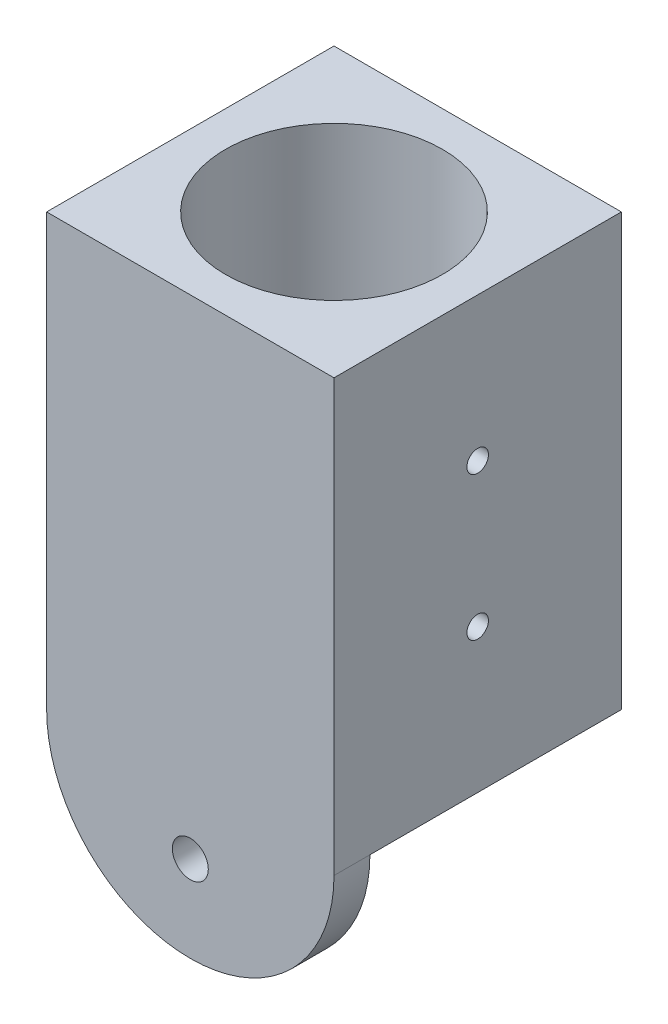
ISO-10303-21;
HEADER;
FILE_DESCRIPTION(('STEP AP214'),'2;1');
FILE_NAME('part.step','',(''),(''),'','','');
FILE_SCHEMA(('AUTOMOTIVE_DESIGN { 1 0 10303 214 1 1 1 1 }'));
ENDSEC;
DATA;
#1=APPLICATION_CONTEXT('core data for automotive mechanical design processes');
#2=APPLICATION_PROTOCOL_DEFINITION('international standard','automotive_design',2000,#1);
#3=PRODUCT_CONTEXT('',#1,'mechanical');
#4=PRODUCT('Part','Part','',(#3));
#5=PRODUCT_RELATED_PRODUCT_CATEGORY('part','',(#4));
#6=PRODUCT_DEFINITION_FORMATION('','',#4);
#7=PRODUCT_DEFINITION_CONTEXT('part definition',#1,'design');
#8=PRODUCT_DEFINITION('design','',#6,#7);
#9=PRODUCT_DEFINITION_SHAPE('','',#8);
#10=(LENGTH_UNIT() NAMED_UNIT(*) SI_UNIT(.MILLI.,.METRE.));
#11=(NAMED_UNIT(*) PLANE_ANGLE_UNIT() SI_UNIT($,.RADIAN.));
#12=(NAMED_UNIT(*) SI_UNIT($,.STERADIAN.) SOLID_ANGLE_UNIT());
#13=UNCERTAINTY_MEASURE_WITH_UNIT(LENGTH_MEASURE(1.E-05),#10,'distance_accuracy_value','');
#14=(GEOMETRIC_REPRESENTATION_CONTEXT(3) GLOBAL_UNCERTAINTY_ASSIGNED_CONTEXT((#13)) GLOBAL_UNIT_ASSIGNED_CONTEXT((#10,
#11,#12)) REPRESENTATION_CONTEXT('',''));
#15=CARTESIAN_POINT('',(0.,0.,0.));
#16=DIRECTION('',(0.,0.,1.));
#17=DIRECTION('',(1.,0.,0.));
#18=AXIS2_PLACEMENT_3D('',#15,#16,#17);
#19=CARTESIAN_POINT('',(0.,0.,0.));
#20=DIRECTION('',(0.,1.,0.));
#21=DIRECTION('',(0.,0.,1.));
#22=AXIS2_PLACEMENT_3D('',#19,#20,#21);
#23=PLANE('',#22);
#24=DIRECTION('',(-1.,0.,0.));
#25=VECTOR('',#24,1.);
#26=CARTESIAN_POINT('',(-20.,0.,15.));
#27=LINE('',#26,#25);
#28=CARTESIAN_POINT('',(20.,0.,15.));
#29=VERTEX_POINT('',#28);
#30=CARTESIAN_POINT('',(-20.,0.,15.));
#31=VERTEX_POINT('',#30);
#32=EDGE_CURVE('E108',#29,#31,#27,.T.);
#33=ORIENTED_EDGE('',*,*,#32,.T.);
#34=DIRECTION('',(0.,0.,1.));
#35=VECTOR('',#34,1.);
#36=CARTESIAN_POINT('',(-20.,0.,-20.));
#37=LINE('',#36,#35);
#38=CARTESIAN_POINT('',(-20.,0.,-20.));
#39=VERTEX_POINT('',#38);
#40=EDGE_CURVE('E123',#39,#31,#37,.T.);
#41=ORIENTED_EDGE('',*,*,#40,.F.);
#42=DIRECTION('',(-1.,0.,0.));
#43=VECTOR('',#42,1.);
#44=CARTESIAN_POINT('',(-20.,0.,-20.));
#45=LINE('',#44,#43);
#46=CARTESIAN_POINT('',(20.,0.,-20.));
#47=VERTEX_POINT('',#46);
#48=EDGE_CURVE('E76',#47,#39,#45,.T.);
#49=ORIENTED_EDGE('',*,*,#48,.F.);
#50=DIRECTION('',(0.,0.,-1.));
#51=VECTOR('',#50,1.);
#52=CARTESIAN_POINT('',(20.,0.,-20.));
#53=LINE('',#52,#51);
#54=EDGE_CURVE('E116',#29,#47,#53,.T.);
#55=ORIENTED_EDGE('',*,*,#54,.F.);
#56=EDGE_LOOP('',(#33,#41,#49,#55));
#57=FACE_BOUND('',#56,.T.);
#58=ADVANCED_FACE('F38',(#57),#23,.F.);
#59=CARTESIAN_POINT('',(20.,60.,-20.));
#60=DIRECTION('',(-1.,0.,0.));
#61=DIRECTION('',(0.,0.,1.));
#62=AXIS2_PLACEMENT_3D('',#59,#60,#61);
#63=PLANE('',#62);
#64=CARTESIAN_POINT('',(20.,40.,0.));
#65=DIRECTION('',(1.,0.,0.));
#66=DIRECTION('',(0.,0.,-1.));
#67=AXIS2_PLACEMENT_3D('',#64,#65,#66);
#68=CIRCLE('',#67,1.5);
#69=CARTESIAN_POINT('',(20.,40.,-1.5));
#70=VERTEX_POINT('',#69);
#71=EDGE_CURVE('E250',#70,#70,#68,.T.);
#72=ORIENTED_EDGE('',*,*,#71,.F.);
#73=EDGE_LOOP('',(#72));
#74=FACE_BOUND('',#73,.T.);
#75=CARTESIAN_POINT('',(20.,20.,0.));
#76=DIRECTION('',(1.,0.,0.));
#77=DIRECTION('',(0.,0.,-1.));
#78=AXIS2_PLACEMENT_3D('',#75,#76,#77);
#79=CIRCLE('',#78,1.5);
#80=CARTESIAN_POINT('',(20.,20.,-1.5));
#81=VERTEX_POINT('',#80);
#82=EDGE_CURVE('E243',#81,#81,#79,.T.);
#83=ORIENTED_EDGE('',*,*,#82,.F.);
#84=EDGE_LOOP('',(#83));
#85=FACE_BOUND('',#84,.T.);
#86=CARTESIAN_POINT('',(20.,0.,20.));
#87=VERTEX_POINT('',#86);
#88=EDGE_CURVE('E102',#87,#29,#53,.T.);
#89=ORIENTED_EDGE('',*,*,#88,.T.);
#90=ORIENTED_EDGE('',*,*,#54,.T.);
#91=DIRECTION('',(0.,-1.,0.));
#92=VECTOR('',#91,1.);
#93=CARTESIAN_POINT('',(20.,60.,-20.));
#94=LINE('',#93,#92);
#95=CARTESIAN_POINT('',(20.,60.,-20.));
#96=VERTEX_POINT('',#95);
#97=EDGE_CURVE('E11',#96,#47,#94,.T.);
#98=ORIENTED_EDGE('',*,*,#97,.F.);
#99=DIRECTION('',(0.,0.,-1.));
#100=VECTOR('',#99,1.);
#101=CARTESIAN_POINT('',(20.,60.,-20.));
#102=LINE('',#101,#100);
#103=CARTESIAN_POINT('',(20.,60.,20.));
#104=VERTEX_POINT('',#103);
#105=EDGE_CURVE('E129',#104,#96,#102,.T.);
#106=ORIENTED_EDGE('',*,*,#105,.F.);
#107=DIRECTION('',(0.,-1.,0.));
#108=VECTOR('',#107,1.);
#109=CARTESIAN_POINT('',(20.,60.,20.));
#110=LINE('',#109,#108);
#111=EDGE_CURVE('E122',#104,#87,#110,.T.);
#112=ORIENTED_EDGE('',*,*,#111,.T.);
#113=EDGE_LOOP('',(#89,#90,#98,#106,#112));
#114=FACE_BOUND('',#113,.T.);
#115=ADVANCED_FACE('F40',(#74,#85,#114),#63,.F.);
#116=CARTESIAN_POINT('',(-20.,60.,-20.));
#117=DIRECTION('',(0.,0.,1.));
#118=DIRECTION('',(1.,0.,0.));
#119=AXIS2_PLACEMENT_3D('',#116,#117,#118);
#120=PLANE('',#119);
#121=ORIENTED_EDGE('',*,*,#48,.T.);
#122=DIRECTION('',(0.,-1.,0.));
#123=VECTOR('',#122,1.);
#124=CARTESIAN_POINT('',(-20.,60.,-20.));
#125=LINE('',#124,#123);
#126=CARTESIAN_POINT('',(-20.,60.,-20.));
#127=VERTEX_POINT('',#126);
#128=EDGE_CURVE('E53',#127,#39,#125,.T.);
#129=ORIENTED_EDGE('',*,*,#128,.F.);
#130=DIRECTION('',(-1.,0.,0.));
#131=VECTOR('',#130,1.);
#132=CARTESIAN_POINT('',(-20.,60.,-20.));
#133=LINE('',#132,#131);
#134=EDGE_CURVE('E88',#96,#127,#133,.T.);
#135=ORIENTED_EDGE('',*,*,#134,.F.);
#136=ORIENTED_EDGE('',*,*,#97,.T.);
#137=EDGE_LOOP('',(#121,#129,#135,#136));
#138=FACE_BOUND('',#137,.T.);
#139=ADVANCED_FACE('F182',(#138),#120,.F.);
#140=CARTESIAN_POINT('',(-20.,60.,-20.));
#141=DIRECTION('',(1.,0.,0.));
#142=DIRECTION('',(0.,0.,-1.));
#143=AXIS2_PLACEMENT_3D('',#140,#141,#142);
#144=PLANE('',#143);
#145=CARTESIAN_POINT('',(-20.,40.,0.));
#146=DIRECTION('',(1.,0.,0.));
#147=DIRECTION('',(0.,0.,-1.));
#148=AXIS2_PLACEMENT_3D('',#145,#146,#147);
#149=CIRCLE('',#148,1.5);
#150=CARTESIAN_POINT('',(-20.,40.,-1.5));
#151=VERTEX_POINT('',#150);
#152=EDGE_CURVE('E240',#151,#151,#149,.T.);
#153=ORIENTED_EDGE('',*,*,#152,.T.);
#154=EDGE_LOOP('',(#153));
#155=FACE_BOUND('',#154,.T.);
#156=CARTESIAN_POINT('',(-20.,20.,0.));
#157=DIRECTION('',(1.,0.,0.));
#158=DIRECTION('',(0.,0.,-1.));
#159=AXIS2_PLACEMENT_3D('',#156,#157,#158);
#160=CIRCLE('',#159,1.5);
#161=CARTESIAN_POINT('',(-20.,20.,-1.5));
#162=VERTEX_POINT('',#161);
#163=EDGE_CURVE('E142',#162,#162,#160,.T.);
#164=ORIENTED_EDGE('',*,*,#163,.T.);
#165=EDGE_LOOP('',(#164));
#166=FACE_BOUND('',#165,.T.);
#167=ORIENTED_EDGE('',*,*,#40,.T.);
#168=DIRECTION('',(0.,0.,1.));
#169=VECTOR('',#168,1.);
#170=CARTESIAN_POINT('',(-20.,0.,15.));
#171=LINE('',#170,#169);
#172=CARTESIAN_POINT('',(-20.,0.,20.));
#173=VERTEX_POINT('',#172);
#174=EDGE_CURVE('E105',#31,#173,#171,.T.);
#175=ORIENTED_EDGE('',*,*,#174,.T.);
#176=DIRECTION('',(0.,-1.,0.));
#177=VECTOR('',#176,1.);
#178=CARTESIAN_POINT('',(-20.,60.,20.));
#179=LINE('',#178,#177);
#180=CARTESIAN_POINT('',(-20.,60.,20.));
#181=VERTEX_POINT('',#180);
#182=EDGE_CURVE('E131',#181,#173,#179,.T.);
#183=ORIENTED_EDGE('',*,*,#182,.F.);
#184=DIRECTION('',(0.,0.,1.));
#185=VECTOR('',#184,1.);
#186=CARTESIAN_POINT('',(-20.,60.,-20.));
#187=LINE('',#186,#185);
#188=EDGE_CURVE('E273',#127,#181,#187,.T.);
#189=ORIENTED_EDGE('',*,*,#188,.F.);
#190=ORIENTED_EDGE('',*,*,#128,.T.);
#191=EDGE_LOOP('',(#167,#175,#183,#189,#190));
#192=FACE_BOUND('',#191,.T.);
#193=ADVANCED_FACE('F188',(#155,#166,#192),#144,.F.);
#194=CARTESIAN_POINT('',(-20.,60.,20.));
#195=DIRECTION('',(0.,0.,-1.));
#196=DIRECTION('',(-1.,0.,0.));
#197=AXIS2_PLACEMENT_3D('',#194,#195,#196);
#198=PLANE('',#197);
#199=ORIENTED_EDGE('',*,*,#182,.T.);
#200=CARTESIAN_POINT('',(0.,0.,20.));
#201=DIRECTION('',(0.,0.,1.));
#202=DIRECTION('',(1.,0.,0.));
#203=AXIS2_PLACEMENT_3D('',#200,#201,#202);
#204=CIRCLE('',#203,20.);
#205=EDGE_CURVE('E83',#173,#87,#204,.T.);
#206=ORIENTED_EDGE('',*,*,#205,.T.);
#207=ORIENTED_EDGE('',*,*,#111,.F.);
#208=DIRECTION('',(1.,0.,0.));
#209=VECTOR('',#208,1.);
#210=CARTESIAN_POINT('',(-20.,60.,20.));
#211=LINE('',#210,#209);
#212=EDGE_CURVE('E62',#181,#104,#211,.T.);
#213=ORIENTED_EDGE('',*,*,#212,.F.);
#214=EDGE_LOOP('',(#199,#206,#207,#213));
#215=FACE_BOUND('',#214,.T.);
#216=CARTESIAN_POINT('',(0.,-8.,20.));
#217=DIRECTION('',(0.,0.,1.));
#218=DIRECTION('',(1.,0.,0.));
#219=AXIS2_PLACEMENT_3D('',#216,#217,#218);
#220=CIRCLE('',#219,2.5);
#221=CARTESIAN_POINT('',(2.5,-8.,20.));
#222=VERTEX_POINT('',#221);
#223=EDGE_CURVE('E263',#222,#222,#220,.T.);
#224=ORIENTED_EDGE('',*,*,#223,.F.);
#225=EDGE_LOOP('',(#224));
#226=FACE_BOUND('',#225,.T.);
#227=ADVANCED_FACE('F185',(#215,#226),#198,.F.);
#228=CARTESIAN_POINT('',(0.,60.,0.));
#229=DIRECTION('',(0.,1.,0.));
#230=DIRECTION('',(0.,0.,1.));
#231=AXIS2_PLACEMENT_3D('',#228,#229,#230);
#232=PLANE('',#231);
#233=CARTESIAN_POINT('',(0.,60.,0.));
#234=DIRECTION('',(0.,1.,0.));
#235=DIRECTION('',(0.,0.,1.));
#236=AXIS2_PLACEMENT_3D('',#233,#234,#235);
#237=CIRCLE('',#236,15.1);
#238=CARTESIAN_POINT('',(0.,60.,15.1));
#239=VERTEX_POINT('',#238);
#240=EDGE_CURVE('E268',#239,#239,#237,.T.);
#241=ORIENTED_EDGE('',*,*,#240,.F.);
#242=EDGE_LOOP('',(#241));
#243=FACE_BOUND('',#242,.T.);
#244=ORIENTED_EDGE('',*,*,#105,.T.);
#245=ORIENTED_EDGE('',*,*,#134,.T.);
#246=ORIENTED_EDGE('',*,*,#188,.T.);
#247=ORIENTED_EDGE('',*,*,#212,.T.);
#248=EDGE_LOOP('',(#244,#245,#246,#247));
#249=FACE_BOUND('',#248,.T.);
#250=ADVANCED_FACE('F174',(#243,#249),#232,.T.);
#251=CARTESIAN_POINT('',(0.,9.99999999999999,0.));
#252=DIRECTION('',(0.,1.,0.));
#253=DIRECTION('',(0.,0.,1.));
#254=AXIS2_PLACEMENT_3D('',#251,#252,#253);
#255=CYLINDRICAL_SURFACE('',#254,15.1);
#256=CARTESIAN_POINT('',(-15.0253119767944,40.,-1.5));
#257=CARTESIAN_POINT('',(-15.025312956074,39.9159676620919,-1.49999635854613));
#258=CARTESIAN_POINT('',(-15.0260245276725,39.8318796909114,-1.49291478510042));
#259=CARTESIAN_POINT('',(-15.028793551497,39.6660349131521,-1.46477185820528));
#260=CARTESIAN_POINT('',(-15.03085248871,39.5842807826705,-1.44369507968879));
#261=CARTESIAN_POINT('',(-15.0360807748948,39.4255293978987,-1.38818135253405));
#262=CARTESIAN_POINT('',(-15.0392494524589,39.3485293004147,-1.35375248074173));
#263=CARTESIAN_POINT('',(-15.0463393621317,39.201417488061,-1.27252733745513));
#264=CARTESIAN_POINT('',(-15.05026044424,39.1313044043924,-1.22573353035035));
#265=CARTESIAN_POINT('',(-15.0584291270942,38.9996884271419,-1.12092628167147));
#266=CARTESIAN_POINT('',(-15.0626777301768,38.9382137328839,-1.06287750232365));
#267=CARTESIAN_POINT('',(-15.0710136412484,38.8258623723675,-0.937283575420634));
#268=CARTESIAN_POINT('',(-15.0751009418651,38.7749861900552,-0.869737994461096));
#269=CARTESIAN_POINT('',(-15.0826635983521,38.6851787557144,-0.72689531541232));
#270=CARTESIAN_POINT('',(-15.0861376707466,38.6462724329321,-0.651582470180894));
#271=CARTESIAN_POINT('',(-15.0920715347339,38.5816686124249,-0.495452469131725));
#272=CARTESIAN_POINT('',(-15.0945313507482,38.5559707966588,-0.414635445899537));
#273=CARTESIAN_POINT('',(-15.0981525138302,38.5185960854439,-0.250075883600476));
#274=CARTESIAN_POINT('',(-15.0993181456551,38.5068729134921,-0.166343950618246));
#275=CARTESIAN_POINT('',(-15.100234174601,38.4976370858915,0.00190655759439232));
#276=CARTESIAN_POINT('',(-15.0999846079687,38.5001240662856,0.0864251126221106));
#277=CARTESIAN_POINT('',(-15.0981018679929,38.5192003682383,0.253535560434282));
#278=CARTESIAN_POINT('',(-15.0964735769364,38.5357399280402,0.336133196401713));
#279=CARTESIAN_POINT('',(-15.0920219994832,38.5823743756564,0.497374352123942));
#280=CARTESIAN_POINT('',(-15.0891986977396,38.612469437557,0.576017821082989));
#281=CARTESIAN_POINT('',(-15.0826661343107,38.685415201237,0.727275160741129));
#282=CARTESIAN_POINT('',(-15.0789553445811,38.7282879348315,0.799878337650498));
#283=CARTESIAN_POINT('',(-15.0710642123586,38.8255560438999,0.936877465459625));
#284=CARTESIAN_POINT('',(-15.0668838562791,38.879951752825,1.00127317876582));
#285=CARTESIAN_POINT('',(-15.0585014337633,38.9990016032106,1.12032085957513));
#286=CARTESIAN_POINT('',(-15.054299351531,39.0636990304483,1.17492954862421));
#287=CARTESIAN_POINT('',(-15.0463651004589,39.201365684078,1.27251801061355));
#288=CARTESIAN_POINT('',(-15.0426329322861,39.2743349222103,1.31549776704826));
#289=CARTESIAN_POINT('',(-15.0360607178808,39.426507005085,1.38860805601259));
#290=CARTESIAN_POINT('',(-15.0332208560381,39.505711134007,1.41873593323833));
#291=CARTESIAN_POINT('',(-15.0287585753405,39.6680883326636,1.46525308871646));
#292=CARTESIAN_POINT('',(-15.0271361198954,39.7512612830321,1.48164277988374));
#293=CARTESIAN_POINT('',(-15.0252986591232,39.9188352636901,1.50016268663854));
#294=CARTESIAN_POINT('',(-15.0250776785925,40.0032295405848,1.50235344042828));
#295=CARTESIAN_POINT('',(-15.0260524182927,40.1711840102969,1.49257225368717));
#296=CARTESIAN_POINT('',(-15.0272481196383,40.2547442142182,1.48060050195128));
#297=CARTESIAN_POINT('',(-15.0309160596127,40.4184822238691,1.44288477969783));
#298=CARTESIAN_POINT('',(-15.0333856461404,40.4986666838853,1.41716941799686));
#299=CARTESIAN_POINT('',(-15.0393209391003,40.6535838762131,1.35272564260952));
#300=CARTESIAN_POINT('',(-15.0427866680578,40.7283164851969,1.31399693465547));
#301=CARTESIAN_POINT('',(-15.0503382064572,40.8704845722181,1.2244741127262));
#302=CARTESIAN_POINT('',(-15.0544260614167,40.9378946728515,1.17363987299589));
#303=CARTESIAN_POINT('',(-15.0627545443571,41.0632469104025,1.06140651663175));
#304=CARTESIAN_POINT('',(-15.0669951760684,41.1211888159303,1.00000714187558));
#305=CARTESIAN_POINT('',(-15.0751694218504,41.2261685790411,0.868123835144984));
#306=CARTESIAN_POINT('',(-15.0791018911967,41.2731669510903,0.797608391658785));
#307=CARTESIAN_POINT('',(-15.0862000664518,41.3546538558809,0.649650329668303));
#308=CARTESIAN_POINT('',(-15.0893657827459,41.389142558064,0.572207805008102));
#309=CARTESIAN_POINT('',(-15.0945685839412,41.4445641728181,0.412731881610149));
#310=CARTESIAN_POINT('',(-15.0966076555916,41.4655209589395,0.330706846940061));
#311=CARTESIAN_POINT('',(-15.099335565752,41.4933617737986,0.164281005364229));
#312=CARTESIAN_POINT('',(-15.1000244416734,41.5002461924544,0.0798802643504142));
#313=CARTESIAN_POINT('',(-15.0999743264919,41.4997414076765,-0.0885132586038638));
#314=CARTESIAN_POINT('',(-15.0992414683536,41.4924135122405,-0.172506232884098));
#315=CARTESIAN_POINT('',(-15.096442335095,41.4638206390987,-0.338061727779914));
#316=CARTESIAN_POINT('',(-15.0943760588904,41.4425556500599,-0.419624246419132));
#317=CARTESIAN_POINT('',(-15.0891416171645,41.3867091488097,-0.578003288244201));
#318=CARTESIAN_POINT('',(-15.0859735976019,41.3521294004693,-0.654820438508598));
#319=CARTESIAN_POINT('',(-15.078888864656,41.2706415319087,-0.801569837575121));
#320=CARTESIAN_POINT('',(-15.0749721559724,41.2237334890742,-0.871502129590262));
#321=CARTESIAN_POINT('',(-15.0668086636542,41.1186906745015,-1.00281085394436));
#322=CARTESIAN_POINT('',(-15.0625605816352,41.0605102643219,-1.06415069694839));
#323=CARTESIAN_POINT('',(-15.0542241088092,40.9346639349868,-1.17622425255196));
#324=CARTESIAN_POINT('',(-15.050135756584,40.8669957419999,-1.22695541540431));
#325=CARTESIAN_POINT('',(-15.042570630608,40.7239089433625,-1.31647186691678));
#326=CARTESIAN_POINT('',(-15.0390954200226,40.6484712829841,-1.35522680653066));
#327=CARTESIAN_POINT('',(-15.0331686996374,40.4921729527212,-1.41946790711139));
#328=CARTESIAN_POINT('',(-15.0307160348248,40.4113185218565,-1.444969046934));
#329=CARTESIAN_POINT('',(-15.0277311589647,40.2750045514355,-1.47561362318629));
#330=CARTESIAN_POINT('',(-15.0268282506956,40.2204167180033,-1.48474603116336));
#331=CARTESIAN_POINT('',(-15.0256183386627,40.1105606166398,-1.49694040505908));
#332=CARTESIAN_POINT('',(-15.0253113324391,40.0552923515182,-1.50000239603648));
#333=CARTESIAN_POINT('',(-15.0253119767944,40.,-1.5));
#334=B_SPLINE_CURVE_WITH_KNOTS('',3,(#256,#257,#258,#259,#260,#261,#262,#263,#264,#265,#266,
#267,#268,#269,#270,#271,#272,#273,#274,#275,#276,#277,#278,#279,#280,#281,#282,#283,#284,#285,
#286,#287,#288,#289,#290,#291,#292,#293,#294,#295,#296,#297,#298,#299,#300,#301,#302,#303,#304,
#305,#306,#307,#308,#309,#310,#311,#312,#313,#314,#315,#316,#317,#318,#319,#320,#321,#322,#323,
#324,#325,#326,#327,#328,#329,#330,#331,#332,#333),.UNSPECIFIED.,.T.,.F.,(4,2,2,2,2,2,2,2,2,2,2,
2,2,2,2,2,2,2,2,2,2,2,2,2,2,2,2,2,2,2,2,2,2,2,2,2,2,2,4),(0.,0.251895097196481,0.50406828696038,
0.75608917138904,1.00805986471088,1.26083488254587,1.51362143998953,1.76693095868192,
2.02023437776912,2.27269664114699,2.52515243837155,2.77671796950038,3.02828673144791,
3.28029179364622,3.53230414935096,3.7854047994611,4.03850580880849,4.29165908560718,
4.54480475335873,4.79687040216313,5.04893269081457,5.30047231646477,5.552017630503,
5.80440863162634,6.05680579992193,6.31010000309801,6.56339077531053,6.81623345189484,
7.06906912260185,7.32081655553196,7.57256419316889,7.82427849203737,8.07599121091297,
8.32874517901135,8.58155982571251,8.83500997565597,9.08817306120622,9.25391794111063,
9.41966213681694),.UNSPECIFIED.);
#335=CARTESIAN_POINT('',(-15.0253119767944,40.,-1.5));
#336=VERTEX_POINT('',#335);
#337=EDGE_CURVE('E42',#336,#336,#334,.T.);
#338=ORIENTED_EDGE('',*,*,#337,.T.);
#339=EDGE_LOOP('',(#338));
#340=FACE_BOUND('',#339,.T.);
#341=CARTESIAN_POINT('',(15.0253119767944,40.,-1.5));
#342=CARTESIAN_POINT('',(15.025312956074,40.0840323379081,-1.49999635854613));
#343=CARTESIAN_POINT('',(15.0260245276725,40.1681203090886,-1.49291478510043));
#344=CARTESIAN_POINT('',(15.028793551497,40.3339650868479,-1.46477185820529));
#345=CARTESIAN_POINT('',(15.03085248871,40.4157192173295,-1.44369507968879));
#346=CARTESIAN_POINT('',(15.0360807748948,40.5744706021013,-1.38818135253405));
#347=CARTESIAN_POINT('',(15.0392494524589,40.6514706995853,-1.35375248074173));
#348=CARTESIAN_POINT('',(15.0463393621317,40.798582511939,-1.27252733745513));
#349=CARTESIAN_POINT('',(15.05026044424,40.8686955956076,-1.22573353035035));
#350=CARTESIAN_POINT('',(15.0584291270942,41.0003115728581,-1.12092628167147));
#351=CARTESIAN_POINT('',(15.0626777301768,41.0617862671161,-1.06287750232365));
#352=CARTESIAN_POINT('',(15.0710136412484,41.1741376276325,-0.937283575420637));
#353=CARTESIAN_POINT('',(15.0751009418651,41.2250138099448,-0.869737994461099));
#354=CARTESIAN_POINT('',(15.0826635983521,41.3148212442856,-0.726895315412323));
#355=CARTESIAN_POINT('',(15.0861376707466,41.3537275670679,-0.651582470180896));
#356=CARTESIAN_POINT('',(15.0920715347339,41.4183313875751,-0.495452469131727));
#357=CARTESIAN_POINT('',(15.0945313507482,41.4440292033412,-0.41463544589954));
#358=CARTESIAN_POINT('',(15.0981525138302,41.4814039145561,-0.250075883600479));
#359=CARTESIAN_POINT('',(15.0993181456551,41.4931270865079,-0.166343950618248));
#360=CARTESIAN_POINT('',(15.100234174601,41.5023629141085,0.00190655759438969));
#361=CARTESIAN_POINT('',(15.0999846079687,41.4998759337144,0.086425112622108));
#362=CARTESIAN_POINT('',(15.0981018679929,41.4807996317617,0.253535560434279));
#363=CARTESIAN_POINT('',(15.0964735769364,41.4642600719598,0.33613319640171));
#364=CARTESIAN_POINT('',(15.0920219994832,41.4176256243436,0.497374352123939));
#365=CARTESIAN_POINT('',(15.0891986977396,41.387530562443,0.576017821082986));
#366=CARTESIAN_POINT('',(15.0826661343107,41.314584798763,0.727275160741126));
#367=CARTESIAN_POINT('',(15.0789553445811,41.2717120651685,0.799878337650496));
#368=CARTESIAN_POINT('',(15.0710642123586,41.1744439561001,0.936877465459623));
#369=CARTESIAN_POINT('',(15.0668838562791,41.120048247175,1.00127317876582));
#370=CARTESIAN_POINT('',(15.0585014337633,41.0009983967895,1.12032085957512));
#371=CARTESIAN_POINT('',(15.054299351531,40.9363009695517,1.1749295486242));
#372=CARTESIAN_POINT('',(15.0463651004589,40.798634315922,1.27251801061355));
#373=CARTESIAN_POINT('',(15.0426329322861,40.7256650777897,1.31549776704826));
#374=CARTESIAN_POINT('',(15.0360607178808,40.573492994915,1.38860805601259));
#375=CARTESIAN_POINT('',(15.0332208560381,40.494288865993,1.41873593323833));
#376=CARTESIAN_POINT('',(15.0287585753405,40.3319116673364,1.46525308871646));
#377=CARTESIAN_POINT('',(15.0271361198954,40.2487387169679,1.48164277988374));
#378=CARTESIAN_POINT('',(15.0252986591232,40.0811647363099,1.50016268663854));
#379=CARTESIAN_POINT('',(15.0250776785925,39.9967704594153,1.50235344042828));
#380=CARTESIAN_POINT('',(15.0260524182927,39.8288159897031,1.49257225368717));
#381=CARTESIAN_POINT('',(15.0272481196383,39.7452557857818,1.48060050195127));
#382=CARTESIAN_POINT('',(15.0309160596127,39.5815177761309,1.44288477969783));
#383=CARTESIAN_POINT('',(15.0333856461404,39.5013333161148,1.41716941799686));
#384=CARTESIAN_POINT('',(15.0393209391003,39.3464161237869,1.35272564260952));
#385=CARTESIAN_POINT('',(15.0427866680578,39.2716835148031,1.31399693465547));
#386=CARTESIAN_POINT('',(15.0503382064572,39.1295154277819,1.2244741127262));
#387=CARTESIAN_POINT('',(15.0544260614167,39.0621053271485,1.17363987299589));
#388=CARTESIAN_POINT('',(15.0627545443571,38.9367530895975,1.06140651663175));
#389=CARTESIAN_POINT('',(15.0669951760684,38.8788111840697,1.00000714187558));
#390=CARTESIAN_POINT('',(15.0751694218504,38.7738314209589,0.868123835144981));
#391=CARTESIAN_POINT('',(15.0791018911967,38.7268330489097,0.797608391658783));
#392=CARTESIAN_POINT('',(15.0862000664518,38.6453461441191,0.6496503296683));
#393=CARTESIAN_POINT('',(15.0893657827459,38.610857441936,0.572207805008099));
#394=CARTESIAN_POINT('',(15.0945685839412,38.5554358271819,0.412731881610147));
#395=CARTESIAN_POINT('',(15.0966076555916,38.5344790410605,0.330706846940059));
#396=CARTESIAN_POINT('',(15.099335565752,38.5066382262014,0.164281005364227));
#397=CARTESIAN_POINT('',(15.1000244416734,38.4997538075456,0.0798802643504125));
#398=CARTESIAN_POINT('',(15.0999743264919,38.5002585923235,-0.0885132586038657));
#399=CARTESIAN_POINT('',(15.0992414683536,38.5075864877595,-0.1725062328841));
#400=CARTESIAN_POINT('',(15.096442335095,38.5361793609014,-0.338061727779916));
#401=CARTESIAN_POINT('',(15.0943760588904,38.5574443499401,-0.419624246419133));
#402=CARTESIAN_POINT('',(15.0891416171645,38.6132908511903,-0.578003288244204));
#403=CARTESIAN_POINT('',(15.0859735976019,38.6478705995307,-0.654820438508602));
#404=CARTESIAN_POINT('',(15.078888864656,38.7293584680913,-0.801569837575126));
#405=CARTESIAN_POINT('',(15.0749721559724,38.7762665109258,-0.871502129590266));
#406=CARTESIAN_POINT('',(15.0668086636542,38.8813093254985,-1.00281085394436));
#407=CARTESIAN_POINT('',(15.0625605816352,38.9394897356781,-1.06415069694839));
#408=CARTESIAN_POINT('',(15.0542241088092,39.0653360650132,-1.17622425255196));
#409=CARTESIAN_POINT('',(15.050135756584,39.1330042580001,-1.22695541540431));
#410=CARTESIAN_POINT('',(15.042570630608,39.2760910566375,-1.31647186691678));
#411=CARTESIAN_POINT('',(15.0390954200226,39.3515287170159,-1.35522680653066));
#412=CARTESIAN_POINT('',(15.0331686996374,39.5078270472788,-1.41946790711139));
#413=CARTESIAN_POINT('',(15.0307160348248,39.5886814781435,-1.444969046934));
#414=CARTESIAN_POINT('',(15.0277311589647,39.7249954485645,-1.47561362318629));
#415=CARTESIAN_POINT('',(15.0268282506956,39.7795832819967,-1.48474603116336));
#416=CARTESIAN_POINT('',(15.0256183386627,39.8894393833602,-1.49694040505908));
#417=CARTESIAN_POINT('',(15.0253113324391,39.9447076484818,-1.50000239603649));
#418=CARTESIAN_POINT('',(15.0253119767944,40.,-1.5));
#419=B_SPLINE_CURVE_WITH_KNOTS('',3,(#341,#342,#343,#344,#345,#346,#347,#348,#349,#350,#351,
#352,#353,#354,#355,#356,#357,#358,#359,#360,#361,#362,#363,#364,#365,#366,#367,#368,#369,#370,
#371,#372,#373,#374,#375,#376,#377,#378,#379,#380,#381,#382,#383,#384,#385,#386,#387,#388,#389,
#390,#391,#392,#393,#394,#395,#396,#397,#398,#399,#400,#401,#402,#403,#404,#405,#406,#407,#408,
#409,#410,#411,#412,#413,#414,#415,#416,#417,#418),.UNSPECIFIED.,.T.,.F.,(4,2,2,2,2,2,2,2,2,2,2,
2,2,2,2,2,2,2,2,2,2,2,2,2,2,2,2,2,2,2,2,2,2,2,2,2,2,2,4),(0.,0.251895097196481,0.50406828696038,
0.75608917138904,1.00805986471088,1.26083488254587,1.51362143998953,1.76693095868192,
2.02023437776912,2.27269664114699,2.52515243837155,2.77671796950038,3.02828673144791,
3.28029179364622,3.53230414935095,3.78540479946109,4.03850580880849,4.29165908560718,
4.54480475335872,4.79687040216313,5.04893269081456,5.30047231646477,5.552017630503,
5.80440863162633,6.05680579992193,6.31010000309801,6.56339077531053,6.81623345189484,
7.06906912260185,7.32081655553195,7.57256419316888,7.82427849203737,8.07599121091297,
8.32874517901134,8.58155982571251,8.83500997565596,9.08817306120623,9.25391794111063,
9.41966213681694),.UNSPECIFIED.);
#420=CARTESIAN_POINT('',(15.0253119767944,40.,-1.5));
#421=VERTEX_POINT('',#420);
#422=EDGE_CURVE('E244',#421,#421,#419,.T.);
#423=ORIENTED_EDGE('',*,*,#422,.T.);
#424=EDGE_LOOP('',(#423));
#425=FACE_BOUND('',#424,.T.);
#426=CARTESIAN_POINT('',(-15.0253119767944,20.,-1.5));
#427=CARTESIAN_POINT('',(-15.025312956074,19.9159676620919,-1.49999635854613));
#428=CARTESIAN_POINT('',(-15.0260245276725,19.8318796909114,-1.49291478510042));
#429=CARTESIAN_POINT('',(-15.028793551497,19.6660349131521,-1.46477185820528));
#430=CARTESIAN_POINT('',(-15.03085248871,19.5842807826705,-1.44369507968879));
#431=CARTESIAN_POINT('',(-15.0360807748948,19.4255293978987,-1.38818135253405));
#432=CARTESIAN_POINT('',(-15.0392494524589,19.3485293004147,-1.35375248074173));
#433=CARTESIAN_POINT('',(-15.0463393621317,19.201417488061,-1.27252733745513));
#434=CARTESIAN_POINT('',(-15.05026044424,19.1313044043924,-1.22573353035035));
#435=CARTESIAN_POINT('',(-15.0584291270942,18.9996884271419,-1.12092628167147));
#436=CARTESIAN_POINT('',(-15.0626777301768,18.9382137328839,-1.06287750232365));
#437=CARTESIAN_POINT('',(-15.0710136412484,18.8258623723675,-0.937283575420637));
#438=CARTESIAN_POINT('',(-15.0751009418651,18.7749861900552,-0.869737994461099));
#439=CARTESIAN_POINT('',(-15.0826635983521,18.6851787557144,-0.726895315412322));
#440=CARTESIAN_POINT('',(-15.0861376707466,18.6462724329321,-0.651582470180895));
#441=CARTESIAN_POINT('',(-15.0920715347339,18.5816686124249,-0.495452469131726));
#442=CARTESIAN_POINT('',(-15.0945313507482,18.5559707966588,-0.414635445899538));
#443=CARTESIAN_POINT('',(-15.0981525138302,18.5185960854439,-0.250075883600477));
#444=CARTESIAN_POINT('',(-15.0993181456551,18.5068729134921,-0.166343950618246));
#445=CARTESIAN_POINT('',(-15.100234174601,18.4976370858915,0.00190655759439129));
#446=CARTESIAN_POINT('',(-15.0999846079687,18.5001240662856,0.0864251126221095));
#447=CARTESIAN_POINT('',(-15.0981018679929,18.5192003682383,0.253535560434281));
#448=CARTESIAN_POINT('',(-15.0964735769364,18.5357399280402,0.336133196401713));
#449=CARTESIAN_POINT('',(-15.0920219994832,18.5823743756564,0.497374352123941));
#450=CARTESIAN_POINT('',(-15.0891986977396,18.612469437557,0.576017821082989));
#451=CARTESIAN_POINT('',(-15.0826661343107,18.685415201237,0.72727516074113));
#452=CARTESIAN_POINT('',(-15.0789553445811,18.7282879348315,0.7998783376505));
#453=CARTESIAN_POINT('',(-15.0710642123586,18.8255560438999,0.936877465459628));
#454=CARTESIAN_POINT('',(-15.0668838562791,18.879951752825,1.00127317876582));
#455=CARTESIAN_POINT('',(-15.0585014337633,18.9990016032106,1.12032085957513));
#456=CARTESIAN_POINT('',(-15.054299351531,19.0636990304484,1.17492954862421));
#457=CARTESIAN_POINT('',(-15.0463651004589,19.201365684078,1.27251801061355));
#458=CARTESIAN_POINT('',(-15.0426329322861,19.2743349222103,1.31549776704826));
#459=CARTESIAN_POINT('',(-15.0360607178808,19.426507005085,1.3886080560126));
#460=CARTESIAN_POINT('',(-15.0332208560381,19.505711134007,1.41873593323833));
#461=CARTESIAN_POINT('',(-15.0287585753405,19.6680883326636,1.46525308871646));
#462=CARTESIAN_POINT('',(-15.0271361198954,19.7512612830321,1.48164277988374));
#463=CARTESIAN_POINT('',(-15.0252986591232,19.9188352636901,1.50016268663855));
#464=CARTESIAN_POINT('',(-15.0250776785925,20.0032295405847,1.50235344042828));
#465=CARTESIAN_POINT('',(-15.0260524182927,20.1711840102969,1.49257225368717));
#466=CARTESIAN_POINT('',(-15.0272481196383,20.2547442142182,1.48060050195128));
#467=CARTESIAN_POINT('',(-15.0309160596127,20.4184822238692,1.44288477969783));
#468=CARTESIAN_POINT('',(-15.0333856461404,20.4986666838853,1.41716941799686));
#469=CARTESIAN_POINT('',(-15.0393209391003,20.6535838762131,1.35272564260952));
#470=CARTESIAN_POINT('',(-15.0427866680578,20.7283164851969,1.31399693465547));
#471=CARTESIAN_POINT('',(-15.0503382064572,20.8704845722181,1.2244741127262));
#472=CARTESIAN_POINT('',(-15.0544260614167,20.9378946728515,1.17363987299589));
#473=CARTESIAN_POINT('',(-15.0627545443571,21.0632469104025,1.06140651663175));
#474=CARTESIAN_POINT('',(-15.0669951760684,21.1211888159303,1.00000714187558));
#475=CARTESIAN_POINT('',(-15.0751694218504,21.2261685790411,0.868123835144981));
#476=CARTESIAN_POINT('',(-15.0791018911967,21.2731669510903,0.797608391658782));
#477=CARTESIAN_POINT('',(-15.0862000664518,21.3546538558809,0.649650329668299));
#478=CARTESIAN_POINT('',(-15.0893657827459,21.389142558064,0.572207805008099));
#479=CARTESIAN_POINT('',(-15.0945685839412,21.4445641728181,0.412731881610146));
#480=CARTESIAN_POINT('',(-15.0966076555916,21.4655209589395,0.330706846940058));
#481=CARTESIAN_POINT('',(-15.099335565752,21.4933617737986,0.164281005364226));
#482=CARTESIAN_POINT('',(-15.1000244416734,21.5002461924544,0.079880264350411));
#483=CARTESIAN_POINT('',(-15.0999743264919,21.4997414076765,-0.0885132586038666));
#484=CARTESIAN_POINT('',(-15.0992414683536,21.4924135122405,-0.172506232884101));
#485=CARTESIAN_POINT('',(-15.096442335095,21.4638206390987,-0.338061727779915));
#486=CARTESIAN_POINT('',(-15.0943760588904,21.4425556500599,-0.419624246419133));
#487=CARTESIAN_POINT('',(-15.0891416171645,21.3867091488097,-0.578003288244201));
#488=CARTESIAN_POINT('',(-15.0859735976019,21.3521294004693,-0.654820438508598));
#489=CARTESIAN_POINT('',(-15.078888864656,21.2706415319087,-0.801569837575122));
#490=CARTESIAN_POINT('',(-15.0749721559724,21.2237334890742,-0.871502129590263));
#491=CARTESIAN_POINT('',(-15.0668086636542,21.1186906745015,-1.00281085394435));
#492=CARTESIAN_POINT('',(-15.0625605816352,21.0605102643219,-1.06415069694839));
#493=CARTESIAN_POINT('',(-15.0542241088092,20.9346639349868,-1.17622425255196));
#494=CARTESIAN_POINT('',(-15.050135756584,20.8669957419999,-1.22695541540431));
#495=CARTESIAN_POINT('',(-15.042570630608,20.7239089433625,-1.31647186691678));
#496=CARTESIAN_POINT('',(-15.0390954200226,20.6484712829841,-1.35522680653065));
#497=CARTESIAN_POINT('',(-15.0331686996374,20.4921729527212,-1.41946790711139));
#498=CARTESIAN_POINT('',(-15.0307160348248,20.4113185218565,-1.444969046934));
#499=CARTESIAN_POINT('',(-15.0277311589647,20.2750045514355,-1.47561362318629));
#500=CARTESIAN_POINT('',(-15.0268282506956,20.2204167180033,-1.48474603116336));
#501=CARTESIAN_POINT('',(-15.0256183386627,20.1105606166398,-1.49694040505908));
#502=CARTESIAN_POINT('',(-15.0253113324391,20.0552923515182,-1.50000239603648));
#503=CARTESIAN_POINT('',(-15.0253119767944,20.,-1.5));
#504=B_SPLINE_CURVE_WITH_KNOTS('',3,(#426,#427,#428,#429,#430,#431,#432,#433,#434,#435,#436,
#437,#438,#439,#440,#441,#442,#443,#444,#445,#446,#447,#448,#449,#450,#451,#452,#453,#454,#455,
#456,#457,#458,#459,#460,#461,#462,#463,#464,#465,#466,#467,#468,#469,#470,#471,#472,#473,#474,
#475,#476,#477,#478,#479,#480,#481,#482,#483,#484,#485,#486,#487,#488,#489,#490,#491,#492,#493,
#494,#495,#496,#497,#498,#499,#500,#501,#502,#503),.UNSPECIFIED.,.T.,.F.,(4,2,2,2,2,2,2,2,2,2,2,
2,2,2,2,2,2,2,2,2,2,2,2,2,2,2,2,2,2,2,2,2,2,2,2,2,2,2,4),(0.,0.251895097196477,0.50406828696038,
0.756089171389044,1.00805986471088,1.26083488254587,1.51362143998953,1.76693095868192,
2.02023437776912,2.27269664114698,2.52515243837155,2.77671796950038,3.02828673144791,
3.28029179364623,3.53230414935096,3.7854047994611,4.03850580880848,4.29165908560718,
4.54480475335872,4.79687040216312,5.04893269081456,5.30047231646477,5.552017630503,
5.80440863162633,6.05680579992193,6.31010000309801,6.56339077531053,6.81623345189484,
7.06906912260185,7.32081655553195,7.57256419316888,7.82427849203737,8.07599121091297,
8.32874517901134,8.58155982571251,8.83500997565596,9.08817306120623,9.25391794111063,
9.41966213681694),.UNSPECIFIED.);
#505=CARTESIAN_POINT('',(-15.0253119767944,20.,-1.5));
#506=VERTEX_POINT('',#505);
#507=EDGE_CURVE('E141',#506,#506,#504,.T.);
#508=ORIENTED_EDGE('',*,*,#507,.T.);
#509=EDGE_LOOP('',(#508));
#510=FACE_BOUND('',#509,.T.);
#511=CARTESIAN_POINT('',(15.0253119767944,20.,-1.5));
#512=CARTESIAN_POINT('',(15.025312956074,20.0840323379081,-1.49999635854613));
#513=CARTESIAN_POINT('',(15.0260245276725,20.1681203090886,-1.49291478510043));
#514=CARTESIAN_POINT('',(15.028793551497,20.3339650868479,-1.46477185820529));
#515=CARTESIAN_POINT('',(15.03085248871,20.4157192173295,-1.44369507968879));
#516=CARTESIAN_POINT('',(15.0360807748948,20.5744706021013,-1.38818135253405));
#517=CARTESIAN_POINT('',(15.0392494524589,20.6514706995853,-1.35375248074173));
#518=CARTESIAN_POINT('',(15.0463393621317,20.798582511939,-1.27252733745513));
#519=CARTESIAN_POINT('',(15.05026044424,20.8686955956076,-1.22573353035035));
#520=CARTESIAN_POINT('',(15.0584291270942,21.0003115728581,-1.12092628167147));
#521=CARTESIAN_POINT('',(15.0626777301768,21.0617862671161,-1.06287750232365));
#522=CARTESIAN_POINT('',(15.0710136412484,21.1741376276325,-0.93728357542064));
#523=CARTESIAN_POINT('',(15.0751009418651,21.2250138099448,-0.869737994461102));
#524=CARTESIAN_POINT('',(15.0826635983521,21.3148212442856,-0.726895315412325));
#525=CARTESIAN_POINT('',(15.0861376707466,21.3537275670679,-0.651582470180898));
#526=CARTESIAN_POINT('',(15.0920715347339,21.4183313875751,-0.495452469131728));
#527=CARTESIAN_POINT('',(15.0945313507482,21.4440292033412,-0.41463544589954));
#528=CARTESIAN_POINT('',(15.0981525138302,21.4814039145561,-0.25007588360048));
#529=CARTESIAN_POINT('',(15.0993181456551,21.4931270865079,-0.166343950618249));
#530=CARTESIAN_POINT('',(15.100234174601,21.5023629141085,0.00190655759438858));
#531=CARTESIAN_POINT('',(15.0999846079687,21.4998759337144,0.0864251126221068));
#532=CARTESIAN_POINT('',(15.0981018679929,21.4807996317617,0.253535560434279));
#533=CARTESIAN_POINT('',(15.0964735769364,21.4642600719598,0.33613319640171));
#534=CARTESIAN_POINT('',(15.0920219994832,21.4176256243436,0.497374352123939));
#535=CARTESIAN_POINT('',(15.0891986977396,21.387530562443,0.576017821082986));
#536=CARTESIAN_POINT('',(15.0826661343107,21.314584798763,0.727275160741128));
#537=CARTESIAN_POINT('',(15.0789553445811,21.2717120651685,0.799878337650499));
#538=CARTESIAN_POINT('',(15.0710642123586,21.1744439561001,0.936877465459627));
#539=CARTESIAN_POINT('',(15.0668838562791,21.120048247175,1.00127317876582));
#540=CARTESIAN_POINT('',(15.0585014337633,21.0009983967894,1.12032085957513));
#541=CARTESIAN_POINT('',(15.054299351531,20.9363009695516,1.17492954862421));
#542=CARTESIAN_POINT('',(15.0463651004589,20.798634315922,1.27251801061355));
#543=CARTESIAN_POINT('',(15.0426329322861,20.7256650777897,1.31549776704826));
#544=CARTESIAN_POINT('',(15.0360607178808,20.573492994915,1.38860805601259));
#545=CARTESIAN_POINT('',(15.0332208560381,20.494288865993,1.41873593323833));
#546=CARTESIAN_POINT('',(15.0287585753405,20.3319116673364,1.46525308871646));
#547=CARTESIAN_POINT('',(15.0271361198954,20.2487387169679,1.48164277988374));
#548=CARTESIAN_POINT('',(15.0252986591232,20.0811647363099,1.50016268663854));
#549=CARTESIAN_POINT('',(15.0250776785925,19.9967704594153,1.50235344042828));
#550=CARTESIAN_POINT('',(15.0260524182927,19.8288159897031,1.49257225368717));
#551=CARTESIAN_POINT('',(15.0272481196383,19.7452557857818,1.48060050195127));
#552=CARTESIAN_POINT('',(15.0309160596127,19.5815177761309,1.44288477969783));
#553=CARTESIAN_POINT('',(15.0333856461404,19.5013333161147,1.41716941799686));
#554=CARTESIAN_POINT('',(15.0393209391003,19.3464161237869,1.35272564260952));
#555=CARTESIAN_POINT('',(15.0427866680578,19.2716835148031,1.31399693465547));
#556=CARTESIAN_POINT('',(15.0503382064572,19.1295154277819,1.2244741127262));
#557=CARTESIAN_POINT('',(15.0544260614167,19.0621053271485,1.17363987299589));
#558=CARTESIAN_POINT('',(15.0627545443571,18.9367530895975,1.06140651663175));
#559=CARTESIAN_POINT('',(15.0669951760684,18.8788111840697,1.00000714187558));
#560=CARTESIAN_POINT('',(15.0751694218504,18.7738314209589,0.868123835144984));
#561=CARTESIAN_POINT('',(15.0791018911967,18.7268330489097,0.797608391658785));
#562=CARTESIAN_POINT('',(15.0862000664518,18.6453461441191,0.649650329668301));
#563=CARTESIAN_POINT('',(15.0893657827459,18.610857441936,0.572207805008099));
#564=CARTESIAN_POINT('',(15.0945685839412,18.5554358271819,0.412731881610144));
#565=CARTESIAN_POINT('',(15.0966076555916,18.5344790410605,0.330706846940056));
#566=CARTESIAN_POINT('',(15.099335565752,18.5066382262014,0.164281005364223));
#567=CARTESIAN_POINT('',(15.1000244416734,18.4997538075456,0.0798802643504088));
#568=CARTESIAN_POINT('',(15.0999743264919,18.5002585923235,-0.0885132586038688));
#569=CARTESIAN_POINT('',(15.0992414683536,18.5075864877595,-0.172506232884103));
#570=CARTESIAN_POINT('',(15.096442335095,18.5361793609013,-0.338061727779917));
#571=CARTESIAN_POINT('',(15.0943760588904,18.5574443499401,-0.419624246419135));
#572=CARTESIAN_POINT('',(15.0891416171645,18.6132908511903,-0.578003288244203));
#573=CARTESIAN_POINT('',(15.0859735976019,18.6478705995307,-0.6548204385086));
#574=CARTESIAN_POINT('',(15.078888864656,18.7293584680913,-0.801569837575124));
#575=CARTESIAN_POINT('',(15.0749721559724,18.7762665109258,-0.871502129590266));
#576=CARTESIAN_POINT('',(15.0668086636542,18.8813093254985,-1.00281085394436));
#577=CARTESIAN_POINT('',(15.0625605816352,18.9394897356781,-1.06415069694839));
#578=CARTESIAN_POINT('',(15.0542241088092,19.0653360650132,-1.17622425255196));
#579=CARTESIAN_POINT('',(15.050135756584,19.1330042580001,-1.22695541540431));
#580=CARTESIAN_POINT('',(15.042570630608,19.2760910566375,-1.31647186691679));
#581=CARTESIAN_POINT('',(15.0390954200226,19.3515287170159,-1.35522680653066));
#582=CARTESIAN_POINT('',(15.0331686996374,19.5078270472788,-1.41946790711139));
#583=CARTESIAN_POINT('',(15.0307160348248,19.5886814781435,-1.444969046934));
#584=CARTESIAN_POINT('',(15.0277311589647,19.7249954485645,-1.47561362318629));
#585=CARTESIAN_POINT('',(15.0268282506956,19.7795832819967,-1.48474603116336));
#586=CARTESIAN_POINT('',(15.0256183386627,19.8894393833602,-1.49694040505908));
#587=CARTESIAN_POINT('',(15.0253113324391,19.9447076484818,-1.50000239603649));
#588=CARTESIAN_POINT('',(15.0253119767944,20.,-1.5));
#589=B_SPLINE_CURVE_WITH_KNOTS('',3,(#511,#512,#513,#514,#515,#516,#517,#518,#519,#520,#521,
#522,#523,#524,#525,#526,#527,#528,#529,#530,#531,#532,#533,#534,#535,#536,#537,#538,#539,#540,
#541,#542,#543,#544,#545,#546,#547,#548,#549,#550,#551,#552,#553,#554,#555,#556,#557,#558,#559,
#560,#561,#562,#563,#564,#565,#566,#567,#568,#569,#570,#571,#572,#573,#574,#575,#576,#577,#578,
#579,#580,#581,#582,#583,#584,#585,#586,#587,#588),.UNSPECIFIED.,.T.,.F.,(4,2,2,2,2,2,2,2,2,2,2,
2,2,2,2,2,2,2,2,2,2,2,2,2,2,2,2,2,2,2,2,2,2,2,2,2,2,2,4),(0.,0.251895097196477,0.50406828696038,
0.756089171389044,1.00805986471088,1.26083488254587,1.51362143998953,1.76693095868191,
2.02023437776912,2.27269664114698,2.52515243837155,2.77671796950038,3.02828673144791,
3.28029179364623,3.53230414935096,3.7854047994611,4.03850580880848,4.29165908560718,
4.54480475335872,4.79687040216312,5.04893269081456,5.30047231646477,5.552017630503,
5.80440863162632,6.05680579992193,6.310100003098,6.56339077531053,6.81623345189484,
7.06906912260185,7.32081655553195,7.57256419316888,7.82427849203737,8.07599121091297,
8.32874517901134,8.5815598257125,8.83500997565596,9.08817306120623,9.25391794111062,
9.41966213681694),.UNSPECIFIED.);
#590=CARTESIAN_POINT('',(15.0253119767944,20.,-1.5));
#591=VERTEX_POINT('',#590);
#592=EDGE_CURVE('E134',#591,#591,#589,.T.);
#593=ORIENTED_EDGE('',*,*,#592,.T.);
#594=EDGE_LOOP('',(#593));
#595=FACE_BOUND('',#594,.T.);
#596=CARTESIAN_POINT('',(0.,9.99999999999999,0.));
#597=DIRECTION('',(0.,1.,0.));
#598=DIRECTION('',(0.,0.,1.));
#599=AXIS2_PLACEMENT_3D('',#596,#597,#598);
#600=CIRCLE('',#599,15.1);
#601=CARTESIAN_POINT('',(0.,9.99999999999999,15.1));
#602=VERTEX_POINT('',#601);
#603=EDGE_CURVE('E119',#602,#602,#600,.T.);
#604=ORIENTED_EDGE('',*,*,#603,.F.);
#605=EDGE_LOOP('',(#604));
#606=FACE_BOUND('',#605,.T.);
#607=ORIENTED_EDGE('',*,*,#240,.T.);
#608=EDGE_LOOP('',(#607));
#609=FACE_BOUND('',#608,.T.);
#610=ADVANCED_FACE('F146',(#340,#425,#510,#595,#606,#609),#255,.F.);
#611=CARTESIAN_POINT('',(0.,9.99999999999999,0.));
#612=DIRECTION('',(0.,1.,0.));
#613=DIRECTION('',(0.,0.,1.));
#614=AXIS2_PLACEMENT_3D('',#611,#612,#613);
#615=PLANE('',#614);
#616=ORIENTED_EDGE('',*,*,#603,.T.);
#617=EDGE_LOOP('',(#616));
#618=FACE_BOUND('',#617,.T.);
#619=ADVANCED_FACE('F168',(#618),#615,.T.);
#620=CARTESIAN_POINT('',(0.,0.,15.));
#621=DIRECTION('',(0.,0.,1.));
#622=DIRECTION('',(1.,0.,0.));
#623=AXIS2_PLACEMENT_3D('',#620,#621,#622);
#624=CYLINDRICAL_SURFACE('',#623,20.);
#625=ORIENTED_EDGE('',*,*,#205,.F.);
#626=ORIENTED_EDGE('',*,*,#174,.F.);
#627=CARTESIAN_POINT('',(0.,0.,15.));
#628=DIRECTION('',(0.,0.,1.));
#629=DIRECTION('',(1.,0.,0.));
#630=AXIS2_PLACEMENT_3D('',#627,#628,#629);
#631=CIRCLE('',#630,20.);
#632=EDGE_CURVE('E98',#31,#29,#631,.T.);
#633=ORIENTED_EDGE('',*,*,#632,.T.);
#634=ORIENTED_EDGE('',*,*,#88,.F.);
#635=EDGE_LOOP('',(#625,#626,#633,#634));
#636=FACE_BOUND('',#635,.T.);
#637=ADVANCED_FACE('F100',(#636),#624,.T.);
#638=CARTESIAN_POINT('',(0.,0.,15.));
#639=DIRECTION('',(0.,0.,1.));
#640=DIRECTION('',(1.,0.,0.));
#641=AXIS2_PLACEMENT_3D('',#638,#639,#640);
#642=PLANE('',#641);
#643=CARTESIAN_POINT('',(0.,-8.,15.));
#644=DIRECTION('',(0.,0.,1.));
#645=DIRECTION('',(1.,0.,0.));
#646=AXIS2_PLACEMENT_3D('',#643,#644,#645);
#647=CIRCLE('',#646,2.5);
#648=CARTESIAN_POINT('',(2.5,-8.,15.));
#649=VERTEX_POINT('',#648);
#650=EDGE_CURVE('E260',#649,#649,#647,.T.);
#651=ORIENTED_EDGE('',*,*,#650,.T.);
#652=EDGE_LOOP('',(#651));
#653=FACE_BOUND('',#652,.T.);
#654=ORIENTED_EDGE('',*,*,#632,.F.);
#655=ORIENTED_EDGE('',*,*,#32,.F.);
#656=EDGE_LOOP('',(#654,#655));
#657=FACE_BOUND('',#656,.T.);
#658=ADVANCED_FACE('F111',(#653,#657),#642,.F.);
#659=CARTESIAN_POINT('',(0.,-8.,15.));
#660=DIRECTION('',(0.,0.,1.));
#661=DIRECTION('',(1.,0.,0.));
#662=AXIS2_PLACEMENT_3D('',#659,#660,#661);
#663=CYLINDRICAL_SURFACE('',#662,2.5);
#664=ORIENTED_EDGE('',*,*,#650,.F.);
#665=EDGE_LOOP('',(#664));
#666=FACE_BOUND('',#665,.T.);
#667=ORIENTED_EDGE('',*,*,#223,.T.);
#668=EDGE_LOOP('',(#667));
#669=FACE_BOUND('',#668,.T.);
#670=ADVANCED_FACE('F159',(#666,#669),#663,.F.);
#671=CARTESIAN_POINT('',(-20.,20.,0.));
#672=DIRECTION('',(1.,0.,0.));
#673=DIRECTION('',(0.,0.,-1.));
#674=AXIS2_PLACEMENT_3D('',#671,#672,#673);
#675=CYLINDRICAL_SURFACE('',#674,1.5);
#676=ORIENTED_EDGE('',*,*,#82,.T.);
#677=EDGE_LOOP('',(#676));
#678=FACE_BOUND('',#677,.T.);
#679=ORIENTED_EDGE('',*,*,#592,.F.);
#680=EDGE_LOOP('',(#679));
#681=FACE_BOUND('',#680,.T.);
#682=ADVANCED_FACE('F155',(#678,#681),#675,.F.);
#683=ORIENTED_EDGE('',*,*,#163,.F.);
#684=EDGE_LOOP('',(#683));
#685=FACE_BOUND('',#684,.T.);
#686=ORIENTED_EDGE('',*,*,#507,.F.);
#687=EDGE_LOOP('',(#686));
#688=FACE_BOUND('',#687,.T.);
#689=ADVANCED_FACE('F150',(#685,#688),#675,.F.);
#690=CARTESIAN_POINT('',(-20.,40.,0.));
#691=DIRECTION('',(1.,0.,0.));
#692=DIRECTION('',(0.,0.,-1.));
#693=AXIS2_PLACEMENT_3D('',#690,#691,#692);
#694=CYLINDRICAL_SURFACE('',#693,1.5);
#695=ORIENTED_EDGE('',*,*,#71,.T.);
#696=EDGE_LOOP('',(#695));
#697=FACE_BOUND('',#696,.T.);
#698=ORIENTED_EDGE('',*,*,#422,.F.);
#699=EDGE_LOOP('',(#698));
#700=FACE_BOUND('',#699,.T.);
#701=ADVANCED_FACE('F154',(#697,#700),#694,.F.);
#702=ORIENTED_EDGE('',*,*,#152,.F.);
#703=EDGE_LOOP('',(#702));
#704=FACE_BOUND('',#703,.T.);
#705=ORIENTED_EDGE('',*,*,#337,.F.);
#706=EDGE_LOOP('',(#705));
#707=FACE_BOUND('',#706,.T.);
#708=ADVANCED_FACE('F157',(#704,#707),#694,.F.);
#709=CLOSED_SHELL('',(#58,#115,#139,#193,#227,#250,#610,#619,#637,#658,#670,#682,#689,#701,#708));
#710=MANIFOLD_SOLID_BREP('B2',#709);
#711=ADVANCED_BREP_SHAPE_REPRESENTATION('',(#18,#710),#14);
#712=SHAPE_DEFINITION_REPRESENTATION(#9,#711);
ENDSEC;
END-ISO-10303-21;
